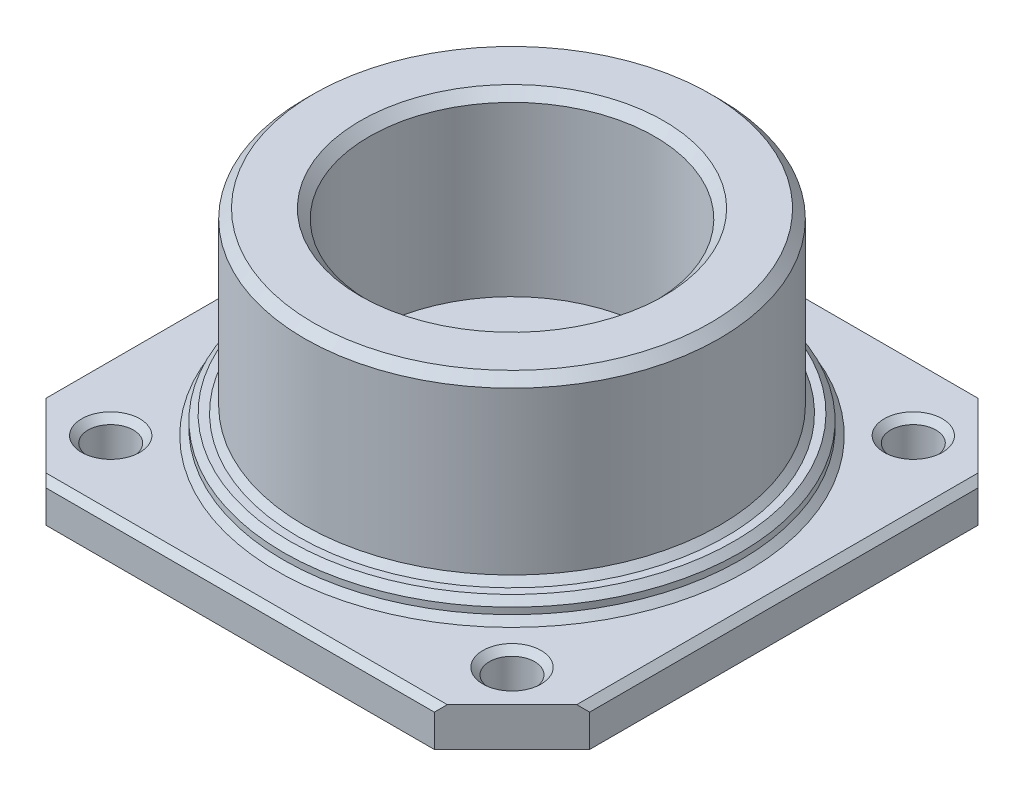
ISO-10303-21;
HEADER;
FILE_DESCRIPTION(('STEP AP214'),'2;1');
FILE_NAME('part.step','',(''),(''),'','','');
FILE_SCHEMA(('AUTOMOTIVE_DESIGN { 1 0 10303 214 1 1 1 1 }'));
ENDSEC;
DATA;
#1=APPLICATION_CONTEXT('core data for automotive mechanical design processes');
#2=APPLICATION_PROTOCOL_DEFINITION('international standard','automotive_design',2000,#1);
#3=PRODUCT_CONTEXT('',#1,'mechanical');
#4=PRODUCT('Part','Part','',(#3));
#5=PRODUCT_RELATED_PRODUCT_CATEGORY('part','',(#4));
#6=PRODUCT_DEFINITION_FORMATION('','',#4);
#7=PRODUCT_DEFINITION_CONTEXT('part definition',#1,'design');
#8=PRODUCT_DEFINITION('design','',#6,#7);
#9=PRODUCT_DEFINITION_SHAPE('','',#8);
#10=(LENGTH_UNIT() NAMED_UNIT(*) SI_UNIT(.MILLI.,.METRE.));
#11=(NAMED_UNIT(*) PLANE_ANGLE_UNIT() SI_UNIT($,.RADIAN.));
#12=(NAMED_UNIT(*) SI_UNIT($,.STERADIAN.) SOLID_ANGLE_UNIT());
#13=UNCERTAINTY_MEASURE_WITH_UNIT(LENGTH_MEASURE(1.E-05),#10,'distance_accuracy_value','');
#14=(GEOMETRIC_REPRESENTATION_CONTEXT(3) GLOBAL_UNCERTAINTY_ASSIGNED_CONTEXT((#13)) GLOBAL_UNIT_ASSIGNED_CONTEXT((#10,
#11,#12)) REPRESENTATION_CONTEXT('',''));
#15=CARTESIAN_POINT('',(0.,0.,0.));
#16=DIRECTION('',(0.,0.,1.));
#17=DIRECTION('',(1.,0.,0.));
#18=AXIS2_PLACEMENT_3D('',#15,#16,#17);
#19=CARTESIAN_POINT('',(0.,17.5,0.));
#20=DIRECTION('',(0.,-1.,0.));
#21=DIRECTION('',(0.,0.,-1.));
#22=AXIS2_PLACEMENT_3D('',#19,#20,#21);
#23=CONICAL_SURFACE('',#22,15.025,0.785398163397445);
#24=CARTESIAN_POINT('',(0.,16.5,0.));
#25=DIRECTION('',(0.,1.,0.));
#26=DIRECTION('',(0.,0.,1.));
#27=AXIS2_PLACEMENT_3D('',#24,#25,#26);
#28=CIRCLE('',#27,16.025);
#29=CARTESIAN_POINT('',(0.,16.5,16.025));
#30=VERTEX_POINT('',#29);
#31=EDGE_CURVE('E308',#30,#30,#28,.F.);
#32=ORIENTED_EDGE('',*,*,#31,.F.);
#33=EDGE_LOOP('',(#32));
#34=FACE_BOUND('',#33,.T.);
#35=CARTESIAN_POINT('',(0.,17.2,0.));
#36=DIRECTION('',(0.,1.,0.));
#37=DIRECTION('',(0.,0.,1.));
#38=AXIS2_PLACEMENT_3D('',#35,#36,#37);
#39=CIRCLE('',#38,15.325);
#40=CARTESIAN_POINT('',(0.,17.2,15.325));
#41=VERTEX_POINT('',#40);
#42=EDGE_CURVE('E194',#41,#41,#39,.F.);
#43=ORIENTED_EDGE('',*,*,#42,.T.);
#44=EDGE_LOOP('',(#43));
#45=FACE_BOUND('',#44,.T.);
#46=ADVANCED_FACE('F44',(#34,#45),#23,.T.);
#47=CARTESIAN_POINT('',(0.,16.5,0.));
#48=DIRECTION('',(0.,1.,0.));
#49=DIRECTION('',(0.,0.,1.));
#50=AXIS2_PLACEMENT_3D('',#47,#48,#49);
#51=CONICAL_SURFACE('',#50,11.025,0.785398163397451);
#52=CARTESIAN_POINT('',(0.,16.5,0.));
#53=DIRECTION('',(0.,1.,0.));
#54=DIRECTION('',(0.,0.,1.));
#55=AXIS2_PLACEMENT_3D('',#52,#53,#54);
#56=CIRCLE('',#55,11.025);
#57=CARTESIAN_POINT('',(0.,16.5,11.025));
#58=VERTEX_POINT('',#57);
#59=EDGE_CURVE('E148',#58,#58,#56,.T.);
#60=ORIENTED_EDGE('',*,*,#59,.F.);
#61=EDGE_LOOP('',(#60));
#62=FACE_BOUND('',#61,.T.);
#63=CARTESIAN_POINT('',(0.,17.2,0.));
#64=DIRECTION('',(0.,1.,0.));
#65=DIRECTION('',(0.,0.,1.));
#66=AXIS2_PLACEMENT_3D('',#63,#64,#65);
#67=CIRCLE('',#66,11.725);
#68=CARTESIAN_POINT('',(0.,17.2,11.725));
#69=VERTEX_POINT('',#68);
#70=EDGE_CURVE('E49',#69,#69,#67,.T.);
#71=ORIENTED_EDGE('',*,*,#70,.T.);
#72=EDGE_LOOP('',(#71));
#73=FACE_BOUND('',#72,.T.);
#74=ADVANCED_FACE('F416',(#62,#73),#51,.F.);
#75=CARTESIAN_POINT('',(0.,3.5,0.));
#76=DIRECTION('',(0.,1.,0.));
#77=DIRECTION('',(0.,0.,1.));
#78=AXIS2_PLACEMENT_3D('',#75,#76,#77);
#79=PLANE('',#78);
#80=CARTESIAN_POINT('',(0.,3.5,0.));
#81=DIRECTION('',(0.,1.,0.));
#82=DIRECTION('',(0.,0.,1.));
#83=AXIS2_PLACEMENT_3D('',#80,#81,#82);
#84=CIRCLE('',#83,4.45);
#85=CARTESIAN_POINT('',(0.,3.5,4.45));
#86=VERTEX_POINT('',#85);
#87=EDGE_CURVE('E258',#86,#86,#84,.F.);
#88=ORIENTED_EDGE('',*,*,#87,.T.);
#89=EDGE_LOOP('',(#88));
#90=FACE_BOUND('',#89,.T.);
#91=CARTESIAN_POINT('',(0.,3.5,0.));
#92=DIRECTION('',(0.,1.,0.));
#93=DIRECTION('',(0.,0.,1.));
#94=AXIS2_PLACEMENT_3D('',#91,#92,#93);
#95=CIRCLE('',#94,11.025);
#96=CARTESIAN_POINT('',(0.,3.5,11.025));
#97=VERTEX_POINT('',#96);
#98=EDGE_CURVE('E198',#97,#97,#95,.T.);
#99=ORIENTED_EDGE('',*,*,#98,.T.);
#100=EDGE_LOOP('',(#99));
#101=FACE_BOUND('',#100,.T.);
#102=ADVANCED_FACE('F422',(#90,#101),#79,.T.);
#103=CARTESIAN_POINT('',(0.,2.,0.));
#104=DIRECTION('',(0.,-1.,0.));
#105=DIRECTION('',(0.,0.,-1.));
#106=AXIS2_PLACEMENT_3D('',#103,#104,#105);
#107=PLANE('',#106);
#108=CARTESIAN_POINT('',(15.5,2.,15.5));
#109=DIRECTION('',(0.,-1.,0.));
#110=DIRECTION('',(0.,0.,-1.));
#111=AXIS2_PLACEMENT_3D('',#108,#109,#110);
#112=CIRCLE('',#111,2.24999999999999);
#113=CARTESIAN_POINT('',(15.5,2.,13.25));
#114=VERTEX_POINT('',#113);
#115=EDGE_CURVE('E242',#114,#114,#112,.T.);
#116=ORIENTED_EDGE('',*,*,#115,.T.);
#117=EDGE_LOOP('',(#116));
#118=FACE_BOUND('',#117,.T.);
#119=CARTESIAN_POINT('',(15.5,2.,-15.5));
#120=DIRECTION('',(0.,-1.,0.));
#121=DIRECTION('',(0.,0.,-1.));
#122=AXIS2_PLACEMENT_3D('',#119,#120,#121);
#123=CIRCLE('',#122,2.25);
#124=CARTESIAN_POINT('',(15.5,2.,-17.75));
#125=VERTEX_POINT('',#124);
#126=EDGE_CURVE('E238',#125,#125,#123,.T.);
#127=ORIENTED_EDGE('',*,*,#126,.T.);
#128=EDGE_LOOP('',(#127));
#129=FACE_BOUND('',#128,.T.);
#130=CARTESIAN_POINT('',(-15.5,2.,15.5));
#131=DIRECTION('',(0.,-1.,0.));
#132=DIRECTION('',(0.,0.,-1.));
#133=AXIS2_PLACEMENT_3D('',#130,#131,#132);
#134=CIRCLE('',#133,2.25);
#135=CARTESIAN_POINT('',(-15.5,2.,13.25));
#136=VERTEX_POINT('',#135);
#137=EDGE_CURVE('E234',#136,#136,#134,.T.);
#138=ORIENTED_EDGE('',*,*,#137,.T.);
#139=EDGE_LOOP('',(#138));
#140=FACE_BOUND('',#139,.T.);
#141=CARTESIAN_POINT('',(-15.5,2.,-15.5));
#142=DIRECTION('',(0.,-1.,0.));
#143=DIRECTION('',(0.,0.,-1.));
#144=AXIS2_PLACEMENT_3D('',#141,#142,#143);
#145=CIRCLE('',#144,2.25);
#146=CARTESIAN_POINT('',(-15.5,2.,-17.75));
#147=VERTEX_POINT('',#146);
#148=EDGE_CURVE('E230',#147,#147,#145,.T.);
#149=ORIENTED_EDGE('',*,*,#148,.T.);
#150=EDGE_LOOP('',(#149));
#151=FACE_BOUND('',#150,.T.);
#152=DIRECTION('',(-1.,0.,0.));
#153=VECTOR('',#152,1.);
#154=CARTESIAN_POINT('',(0.,2.,-20.5));
#155=LINE('',#154,#153);
#156=CARTESIAN_POINT('',(15.5,2.,-20.5));
#157=VERTEX_POINT('',#156);
#158=CARTESIAN_POINT('',(-15.5,2.,-20.5));
#159=VERTEX_POINT('',#158);
#160=EDGE_CURVE('E222',#157,#159,#155,.T.);
#161=ORIENTED_EDGE('',*,*,#160,.T.);
#162=DIRECTION('',(0.707106781186549,0.,-0.707106781186546));
#163=VECTOR('',#162,1.);
#164=CARTESIAN_POINT('',(-21.,2.,-15.));
#165=LINE('',#164,#163);
#166=CARTESIAN_POINT('',(-20.5,2.,-15.5));
#167=VERTEX_POINT('',#166);
#168=EDGE_CURVE('E338',#159,#167,#165,.F.);
#169=ORIENTED_EDGE('',*,*,#168,.T.);
#170=DIRECTION('',(0.,0.,1.));
#171=VECTOR('',#170,1.);
#172=CARTESIAN_POINT('',(-20.5,2.,0.));
#173=LINE('',#172,#171);
#174=CARTESIAN_POINT('',(-20.5,2.,15.5));
#175=VERTEX_POINT('',#174);
#176=EDGE_CURVE('E226',#167,#175,#173,.T.);
#177=ORIENTED_EDGE('',*,*,#176,.T.);
#178=DIRECTION('',(-0.707106781186546,0.,-0.707106781186549));
#179=VECTOR('',#178,1.);
#180=CARTESIAN_POINT('',(-15.,2.,21.));
#181=LINE('',#180,#179);
#182=CARTESIAN_POINT('',(-15.5,2.,20.5));
#183=VERTEX_POINT('',#182);
#184=EDGE_CURVE('E335',#175,#183,#181,.F.);
#185=ORIENTED_EDGE('',*,*,#184,.T.);
#186=DIRECTION('',(1.,0.,0.));
#187=VECTOR('',#186,1.);
#188=CARTESIAN_POINT('',(0.,2.,20.5));
#189=LINE('',#188,#187);
#190=CARTESIAN_POINT('',(15.5,2.,20.5));
#191=VERTEX_POINT('',#190);
#192=EDGE_CURVE('E214',#183,#191,#189,.T.);
#193=ORIENTED_EDGE('',*,*,#192,.T.);
#194=DIRECTION('',(-0.707106781186549,0.,0.707106781186546));
#195=VECTOR('',#194,1.);
#196=CARTESIAN_POINT('',(21.,2.,15.));
#197=LINE('',#196,#195);
#198=CARTESIAN_POINT('',(20.5,2.,15.5));
#199=VERTEX_POINT('',#198);
#200=EDGE_CURVE('E332',#191,#199,#197,.F.);
#201=ORIENTED_EDGE('',*,*,#200,.T.);
#202=DIRECTION('',(0.,0.,-1.));
#203=VECTOR('',#202,1.);
#204=CARTESIAN_POINT('',(20.5,2.,0.));
#205=LINE('',#204,#203);
#206=CARTESIAN_POINT('',(20.5,2.,-15.5));
#207=VERTEX_POINT('',#206);
#208=EDGE_CURVE('E218',#199,#207,#205,.T.);
#209=ORIENTED_EDGE('',*,*,#208,.T.);
#210=DIRECTION('',(0.707106781186546,0.,0.707106781186549));
#211=VECTOR('',#210,1.);
#212=CARTESIAN_POINT('',(15.,2.,-21.));
#213=LINE('',#212,#211);
#214=EDGE_CURVE('E329',#207,#157,#213,.F.);
#215=ORIENTED_EDGE('',*,*,#214,.T.);
#216=EDGE_LOOP('',(#161,#169,#177,#185,#193,#201,#209,#215));
#217=FACE_BOUND('',#216,.T.);
#218=CARTESIAN_POINT('',(0.,2.,0.));
#219=DIRECTION('',(0.,-1.,0.));
#220=DIRECTION('',(0.,0.,-1.));
#221=AXIS2_PLACEMENT_3D('',#218,#219,#220);
#222=CIRCLE('',#221,18.15);
#223=CARTESIAN_POINT('',(0.,2.,-18.15));
#224=VERTEX_POINT('',#223);
#225=EDGE_CURVE('E210',#224,#224,#222,.T.);
#226=ORIENTED_EDGE('',*,*,#225,.T.);
#227=EDGE_LOOP('',(#226));
#228=FACE_BOUND('',#227,.T.);
#229=ADVANCED_FACE('F369',(#118,#129,#140,#151,#217,#228),#107,.F.);
#230=CARTESIAN_POINT('',(21.,2.,21.));
#231=DIRECTION('',(-1.,0.,0.));
#232=DIRECTION('',(0.,0.,1.));
#233=AXIS2_PLACEMENT_3D('',#230,#231,#232);
#234=PLANE('',#233);
#235=DIRECTION('',(0.,0.,1.));
#236=VECTOR('',#235,1.);
#237=CARTESIAN_POINT('',(21.,1.50000000000001,21.));
#238=LINE('',#237,#236);
#239=CARTESIAN_POINT('',(21.,1.50000000000001,-15.));
#240=VERTEX_POINT('',#239);
#241=CARTESIAN_POINT('',(21.,1.50000000000001,15.));
#242=VERTEX_POINT('',#241);
#243=EDGE_CURVE('E301',#240,#242,#238,.T.);
#244=ORIENTED_EDGE('',*,*,#243,.T.);
#245=DIRECTION('',(0.,-1.,0.));
#246=VECTOR('',#245,1.);
#247=CARTESIAN_POINT('',(21.,2.,15.));
#248=LINE('',#247,#246);
#249=CARTESIAN_POINT('',(21.,-1.,15.));
#250=VERTEX_POINT('',#249);
#251=EDGE_CURVE('E360',#242,#250,#248,.T.);
#252=ORIENTED_EDGE('',*,*,#251,.T.);
#253=DIRECTION('',(0.,0.,1.));
#254=VECTOR('',#253,1.);
#255=CARTESIAN_POINT('',(21.,-1.,-15.));
#256=LINE('',#255,#254);
#257=CARTESIAN_POINT('',(21.,-1.,-15.));
#258=VERTEX_POINT('',#257);
#259=EDGE_CURVE('E185',#258,#250,#256,.T.);
#260=ORIENTED_EDGE('',*,*,#259,.F.);
#261=DIRECTION('',(0.,1.,0.));
#262=VECTOR('',#261,1.);
#263=CARTESIAN_POINT('',(21.,2.,-15.));
#264=LINE('',#263,#262);
#265=EDGE_CURVE('E67',#258,#240,#264,.T.);
#266=ORIENTED_EDGE('',*,*,#265,.T.);
#267=EDGE_LOOP('',(#244,#252,#260,#266));
#268=FACE_BOUND('',#267,.T.);
#269=ADVANCED_FACE('F387',(#268),#234,.F.);
#270=CARTESIAN_POINT('',(-21.,2.,-21.));
#271=DIRECTION('',(0.,0.,1.));
#272=DIRECTION('',(1.,0.,0.));
#273=AXIS2_PLACEMENT_3D('',#270,#271,#272);
#274=PLANE('',#273);
#275=DIRECTION('',(0.,-1.,0.));
#276=VECTOR('',#275,1.);
#277=CARTESIAN_POINT('',(15.,2.,-21.));
#278=LINE('',#277,#276);
#279=CARTESIAN_POINT('',(15.,1.50000000000001,-21.));
#280=VERTEX_POINT('',#279);
#281=CARTESIAN_POINT('',(15.,-1.,-21.));
#282=VERTEX_POINT('',#281);
#283=EDGE_CURVE('E317',#280,#282,#278,.T.);
#284=ORIENTED_EDGE('',*,*,#283,.T.);
#285=DIRECTION('',(1.,0.,0.));
#286=VECTOR('',#285,1.);
#287=CARTESIAN_POINT('',(-15.,-1.,-21.));
#288=LINE('',#287,#286);
#289=CARTESIAN_POINT('',(-15.,-1.,-21.));
#290=VERTEX_POINT('',#289);
#291=EDGE_CURVE('E177',#290,#282,#288,.T.);
#292=ORIENTED_EDGE('',*,*,#291,.F.);
#293=DIRECTION('',(0.,1.,0.));
#294=VECTOR('',#293,1.);
#295=CARTESIAN_POINT('',(-15.,2.,-21.));
#296=LINE('',#295,#294);
#297=CARTESIAN_POINT('',(-15.,1.50000000000001,-21.));
#298=VERTEX_POINT('',#297);
#299=EDGE_CURVE('E320',#290,#298,#296,.T.);
#300=ORIENTED_EDGE('',*,*,#299,.T.);
#301=DIRECTION('',(1.,0.,0.));
#302=VECTOR('',#301,1.);
#303=CARTESIAN_POINT('',(-21.,1.50000000000001,-21.));
#304=LINE('',#303,#302);
#305=EDGE_CURVE('E297',#298,#280,#304,.T.);
#306=ORIENTED_EDGE('',*,*,#305,.T.);
#307=EDGE_LOOP('',(#284,#292,#300,#306));
#308=FACE_BOUND('',#307,.T.);
#309=ADVANCED_FACE('F381',(#308),#274,.F.);
#310=CARTESIAN_POINT('',(-21.,2.,21.));
#311=DIRECTION('',(1.,0.,0.));
#312=DIRECTION('',(0.,0.,-1.));
#313=AXIS2_PLACEMENT_3D('',#310,#311,#312);
#314=PLANE('',#313);
#315=DIRECTION('',(0.,0.,-1.));
#316=VECTOR('',#315,1.);
#317=CARTESIAN_POINT('',(-21.,1.50000000000001,21.));
#318=LINE('',#317,#316);
#319=CARTESIAN_POINT('',(-21.,1.50000000000001,15.));
#320=VERTEX_POINT('',#319);
#321=CARTESIAN_POINT('',(-21.,1.50000000000001,-15.));
#322=VERTEX_POINT('',#321);
#323=EDGE_CURVE('E294',#320,#322,#318,.T.);
#324=ORIENTED_EDGE('',*,*,#323,.T.);
#325=DIRECTION('',(0.,-1.,0.));
#326=VECTOR('',#325,1.);
#327=CARTESIAN_POINT('',(-21.,2.,-15.));
#328=LINE('',#327,#326);
#329=CARTESIAN_POINT('',(-21.,-1.,-15.));
#330=VERTEX_POINT('',#329);
#331=EDGE_CURVE('E147',#322,#330,#328,.T.);
#332=ORIENTED_EDGE('',*,*,#331,.T.);
#333=DIRECTION('',(0.,0.,-1.));
#334=VECTOR('',#333,1.);
#335=CARTESIAN_POINT('',(-21.,-1.,15.));
#336=LINE('',#335,#334);
#337=CARTESIAN_POINT('',(-21.,-1.,15.));
#338=VERTEX_POINT('',#337);
#339=EDGE_CURVE('E151',#338,#330,#336,.T.);
#340=ORIENTED_EDGE('',*,*,#339,.F.);
#341=DIRECTION('',(0.,1.,0.));
#342=VECTOR('',#341,1.);
#343=CARTESIAN_POINT('',(-21.,2.,15.));
#344=LINE('',#343,#342);
#345=EDGE_CURVE('E135',#338,#320,#344,.T.);
#346=ORIENTED_EDGE('',*,*,#345,.T.);
#347=EDGE_LOOP('',(#324,#332,#340,#346));
#348=FACE_BOUND('',#347,.T.);
#349=ADVANCED_FACE('F152',(#348),#314,.F.);
#350=CARTESIAN_POINT('',(-21.,2.,21.));
#351=DIRECTION('',(0.,0.,-1.));
#352=DIRECTION('',(-1.,0.,0.));
#353=AXIS2_PLACEMENT_3D('',#350,#351,#352);
#354=PLANE('',#353);
#355=DIRECTION('',(-1.,0.,0.));
#356=VECTOR('',#355,1.);
#357=CARTESIAN_POINT('',(-21.,1.50000000000001,21.));
#358=LINE('',#357,#356);
#359=CARTESIAN_POINT('',(15.,1.50000000000001,21.));
#360=VERTEX_POINT('',#359);
#361=CARTESIAN_POINT('',(-15.,1.50000000000001,21.));
#362=VERTEX_POINT('',#361);
#363=EDGE_CURVE('E304',#360,#362,#358,.T.);
#364=ORIENTED_EDGE('',*,*,#363,.T.);
#365=DIRECTION('',(0.,-1.,0.));
#366=VECTOR('',#365,1.);
#367=CARTESIAN_POINT('',(-15.,2.,21.));
#368=LINE('',#367,#366);
#369=CARTESIAN_POINT('',(-15.,-1.,21.));
#370=VERTEX_POINT('',#369);
#371=EDGE_CURVE('E349',#362,#370,#368,.T.);
#372=ORIENTED_EDGE('',*,*,#371,.T.);
#373=DIRECTION('',(-1.,0.,0.));
#374=VECTOR('',#373,1.);
#375=CARTESIAN_POINT('',(15.,-1.,21.));
#376=LINE('',#375,#374);
#377=CARTESIAN_POINT('',(15.,-1.,21.));
#378=VERTEX_POINT('',#377);
#379=EDGE_CURVE('E165',#378,#370,#376,.T.);
#380=ORIENTED_EDGE('',*,*,#379,.F.);
#381=DIRECTION('',(0.,1.,0.));
#382=VECTOR('',#381,1.);
#383=CARTESIAN_POINT('',(15.,2.,21.));
#384=LINE('',#383,#382);
#385=EDGE_CURVE('E346',#378,#360,#384,.T.);
#386=ORIENTED_EDGE('',*,*,#385,.T.);
#387=EDGE_LOOP('',(#364,#372,#380,#386));
#388=FACE_BOUND('',#387,.T.);
#389=ADVANCED_FACE('F393',(#388),#354,.F.);
#390=CARTESIAN_POINT('',(0.,2.,0.));
#391=DIRECTION('',(0.,-1.,0.));
#392=DIRECTION('',(0.,0.,-1.));
#393=AXIS2_PLACEMENT_3D('',#390,#391,#392);
#394=CYLINDRICAL_SURFACE('',#393,12.65);
#395=CARTESIAN_POINT('',(0.,2.1,0.));
#396=DIRECTION('',(0.,1.,0.));
#397=DIRECTION('',(0.,0.,1.));
#398=AXIS2_PLACEMENT_3D('',#395,#396,#397);
#399=CIRCLE('',#398,12.65);
#400=CARTESIAN_POINT('',(0.,2.1,12.65));
#401=VERTEX_POINT('',#400);
#402=EDGE_CURVE('E202',#401,#401,#399,.T.);
#403=ORIENTED_EDGE('',*,*,#402,.T.);
#404=EDGE_LOOP('',(#403));
#405=FACE_BOUND('',#404,.T.);
#406=CARTESIAN_POINT('',(0.,-1.,0.));
#407=DIRECTION('',(0.,-1.,0.));
#408=DIRECTION('',(0.,0.,-1.));
#409=AXIS2_PLACEMENT_3D('',#406,#407,#408);
#410=CIRCLE('',#409,12.65);
#411=CARTESIAN_POINT('',(0.,-1.,-12.65));
#412=VERTEX_POINT('',#411);
#413=EDGE_CURVE('E592',#412,#412,#410,.T.);
#414=ORIENTED_EDGE('',*,*,#413,.T.);
#415=EDGE_LOOP('',(#414));
#416=FACE_BOUND('',#415,.T.);
#417=ADVANCED_FACE('F506',(#405,#416),#394,.F.);
#418=CARTESIAN_POINT('',(-15.5,2.,-15.5));
#419=DIRECTION('',(0.,-1.,0.));
#420=DIRECTION('',(0.,0.,-1.));
#421=AXIS2_PLACEMENT_3D('',#418,#419,#420);
#422=CYLINDRICAL_SURFACE('',#421,1.75);
#423=CARTESIAN_POINT('',(-15.5,1.50000000000001,-15.5));
#424=DIRECTION('',(0.,-1.,0.));
#425=DIRECTION('',(0.,0.,-1.));
#426=AXIS2_PLACEMENT_3D('',#423,#424,#425);
#427=CIRCLE('',#426,1.75);
#428=CARTESIAN_POINT('',(-15.5,1.50000000000001,-17.25));
#429=VERTEX_POINT('',#428);
#430=EDGE_CURVE('E290',#429,#429,#427,.F.);
#431=ORIENTED_EDGE('',*,*,#430,.T.);
#432=EDGE_LOOP('',(#431));
#433=FACE_BOUND('',#432,.T.);
#434=CARTESIAN_POINT('',(-15.5,-1.,-15.5));
#435=DIRECTION('',(0.,-1.,0.));
#436=DIRECTION('',(0.,0.,-1.));
#437=AXIS2_PLACEMENT_3D('',#434,#435,#436);
#438=CIRCLE('',#437,1.75);
#439=CARTESIAN_POINT('',(-15.5,-1.,-17.25));
#440=VERTEX_POINT('',#439);
#441=EDGE_CURVE('E585',#440,#440,#438,.T.);
#442=ORIENTED_EDGE('',*,*,#441,.T.);
#443=EDGE_LOOP('',(#442));
#444=FACE_BOUND('',#443,.T.);
#445=ADVANCED_FACE('F502',(#433,#444),#422,.F.);
#446=CARTESIAN_POINT('',(15.5,2.,-15.5));
#447=DIRECTION('',(0.,-1.,0.));
#448=DIRECTION('',(0.,0.,-1.));
#449=AXIS2_PLACEMENT_3D('',#446,#447,#448);
#450=CYLINDRICAL_SURFACE('',#449,1.75);
#451=CARTESIAN_POINT('',(15.5,1.5,-15.5));
#452=DIRECTION('',(0.,-1.,0.));
#453=DIRECTION('',(0.,0.,-1.));
#454=AXIS2_PLACEMENT_3D('',#451,#452,#453);
#455=CIRCLE('',#454,1.75);
#456=CARTESIAN_POINT('',(15.5,1.5,-17.25));
#457=VERTEX_POINT('',#456);
#458=EDGE_CURVE('E282',#457,#457,#455,.F.);
#459=ORIENTED_EDGE('',*,*,#458,.T.);
#460=EDGE_LOOP('',(#459));
#461=FACE_BOUND('',#460,.T.);
#462=CARTESIAN_POINT('',(15.5,-1.,-15.5));
#463=DIRECTION('',(0.,-1.,0.));
#464=DIRECTION('',(0.,0.,-1.));
#465=AXIS2_PLACEMENT_3D('',#462,#463,#464);
#466=CIRCLE('',#465,1.75);
#467=CARTESIAN_POINT('',(15.5,-1.,-17.25));
#468=VERTEX_POINT('',#467);
#469=EDGE_CURVE('E588',#468,#468,#466,.T.);
#470=ORIENTED_EDGE('',*,*,#469,.T.);
#471=EDGE_LOOP('',(#470));
#472=FACE_BOUND('',#471,.T.);
#473=ADVANCED_FACE('F498',(#461,#472),#450,.F.);
#474=CARTESIAN_POINT('',(15.5,2.,15.5));
#475=DIRECTION('',(0.,-1.,0.));
#476=DIRECTION('',(0.,0.,-1.));
#477=AXIS2_PLACEMENT_3D('',#474,#475,#476);
#478=CYLINDRICAL_SURFACE('',#477,1.75);
#479=CARTESIAN_POINT('',(15.5,1.5,15.5));
#480=DIRECTION('',(0.,-1.,0.));
#481=DIRECTION('',(0.,0.,-1.));
#482=AXIS2_PLACEMENT_3D('',#479,#480,#481);
#483=CIRCLE('',#482,1.75);
#484=CARTESIAN_POINT('',(15.5,1.5,13.75));
#485=VERTEX_POINT('',#484);
#486=EDGE_CURVE('E206',#485,#485,#483,.F.);
#487=ORIENTED_EDGE('',*,*,#486,.T.);
#488=EDGE_LOOP('',(#487));
#489=FACE_BOUND('',#488,.T.);
#490=CARTESIAN_POINT('',(15.5,-1.,15.5));
#491=DIRECTION('',(0.,-1.,0.));
#492=DIRECTION('',(0.,0.,-1.));
#493=AXIS2_PLACEMENT_3D('',#490,#491,#492);
#494=CIRCLE('',#493,1.75);
#495=CARTESIAN_POINT('',(15.5,-1.,13.75));
#496=VERTEX_POINT('',#495);
#497=EDGE_CURVE('E167',#496,#496,#494,.T.);
#498=ORIENTED_EDGE('',*,*,#497,.T.);
#499=EDGE_LOOP('',(#498));
#500=FACE_BOUND('',#499,.T.);
#501=ADVANCED_FACE('F494',(#489,#500),#478,.F.);
#502=CARTESIAN_POINT('',(-15.5,2.,15.5));
#503=DIRECTION('',(0.,-1.,0.));
#504=DIRECTION('',(0.,0.,-1.));
#505=AXIS2_PLACEMENT_3D('',#502,#503,#504);
#506=CYLINDRICAL_SURFACE('',#505,1.75);
#507=CARTESIAN_POINT('',(-15.5,1.50000000000001,15.5));
#508=DIRECTION('',(0.,-1.,0.));
#509=DIRECTION('',(0.,0.,-1.));
#510=AXIS2_PLACEMENT_3D('',#507,#508,#509);
#511=CIRCLE('',#510,1.75);
#512=CARTESIAN_POINT('',(-15.5,1.50000000000001,13.75));
#513=VERTEX_POINT('',#512);
#514=EDGE_CURVE('E286',#513,#513,#511,.F.);
#515=ORIENTED_EDGE('',*,*,#514,.T.);
#516=EDGE_LOOP('',(#515));
#517=FACE_BOUND('',#516,.T.);
#518=CARTESIAN_POINT('',(-15.5,-1.,15.5));
#519=DIRECTION('',(0.,-1.,0.));
#520=DIRECTION('',(0.,0.,-1.));
#521=AXIS2_PLACEMENT_3D('',#518,#519,#520);
#522=CIRCLE('',#521,1.75);
#523=CARTESIAN_POINT('',(-15.5,-1.,13.75));
#524=VERTEX_POINT('',#523);
#525=EDGE_CURVE('E171',#524,#524,#522,.T.);
#526=ORIENTED_EDGE('',*,*,#525,.T.);
#527=EDGE_LOOP('',(#526));
#528=FACE_BOUND('',#527,.T.);
#529=ADVANCED_FACE('F490',(#517,#528),#506,.F.);
#530=CARTESIAN_POINT('',(0.,2.1,0.));
#531=DIRECTION('',(0.,-1.,0.));
#532=DIRECTION('',(0.,0.,-1.));
#533=AXIS2_PLACEMENT_3D('',#530,#531,#532);
#534=CYLINDRICAL_SURFACE('',#533,17.65);
#535=CARTESIAN_POINT('',(0.,3.00000000000002,0.));
#536=DIRECTION('',(0.,1.,0.));
#537=DIRECTION('',(0.,0.,1.));
#538=AXIS2_PLACEMENT_3D('',#535,#536,#537);
#539=CIRCLE('',#538,17.65);
#540=CARTESIAN_POINT('',(0.,3.00000000000002,17.65));
#541=VERTEX_POINT('',#540);
#542=EDGE_CURVE('E274',#541,#541,#539,.F.);
#543=ORIENTED_EDGE('',*,*,#542,.T.);
#544=EDGE_LOOP('',(#543));
#545=FACE_BOUND('',#544,.T.);
#546=CARTESIAN_POINT('',(0.,2.5,0.));
#547=DIRECTION('',(0.,-1.,0.));
#548=DIRECTION('',(0.,0.,-1.));
#549=AXIS2_PLACEMENT_3D('',#546,#547,#548);
#550=CIRCLE('',#549,17.65);
#551=CARTESIAN_POINT('',(0.,2.5,-17.65));
#552=VERTEX_POINT('',#551);
#553=EDGE_CURVE('E270',#552,#552,#550,.F.);
#554=ORIENTED_EDGE('',*,*,#553,.T.);
#555=EDGE_LOOP('',(#554));
#556=FACE_BOUND('',#555,.T.);
#557=ADVANCED_FACE('F483',(#545,#556),#534,.T.);
#558=CARTESIAN_POINT('',(0.,2.1,0.));
#559=DIRECTION('',(0.,1.,0.));
#560=DIRECTION('',(0.,0.,1.));
#561=AXIS2_PLACEMENT_3D('',#558,#559,#560);
#562=PLANE('',#561);
#563=CARTESIAN_POINT('',(0.,2.1,0.));
#564=DIRECTION('',(0.,1.,0.));
#565=DIRECTION('',(0.,0.,1.));
#566=AXIS2_PLACEMENT_3D('',#563,#564,#565);
#567=CIRCLE('',#566,4.44999999999999);
#568=CARTESIAN_POINT('',(0.,2.1,4.44999999999999));
#569=VERTEX_POINT('',#568);
#570=EDGE_CURVE('E246',#569,#569,#567,.T.);
#571=ORIENTED_EDGE('',*,*,#570,.T.);
#572=EDGE_LOOP('',(#571));
#573=FACE_BOUND('',#572,.T.);
#574=ORIENTED_EDGE('',*,*,#402,.F.);
#575=EDGE_LOOP('',(#574));
#576=FACE_BOUND('',#575,.T.);
#577=ADVANCED_FACE('F480',(#573,#576),#562,.F.);
#578=CARTESIAN_POINT('',(0.,3.5,0.));
#579=DIRECTION('',(0.,-1.,0.));
#580=DIRECTION('',(0.,0.,-1.));
#581=AXIS2_PLACEMENT_3D('',#578,#579,#580);
#582=CYLINDRICAL_SURFACE('',#581,3.95);
#583=CARTESIAN_POINT('',(0.,2.59999999999999,0.));
#584=DIRECTION('',(0.,1.,0.));
#585=DIRECTION('',(0.,0.,1.));
#586=AXIS2_PLACEMENT_3D('',#583,#584,#585);
#587=CIRCLE('',#586,3.95);
#588=CARTESIAN_POINT('',(0.,2.59999999999999,3.95));
#589=VERTEX_POINT('',#588);
#590=EDGE_CURVE('E254',#589,#589,#587,.F.);
#591=ORIENTED_EDGE('',*,*,#590,.T.);
#592=EDGE_LOOP('',(#591));
#593=FACE_BOUND('',#592,.T.);
#594=CARTESIAN_POINT('',(0.,3.,0.));
#595=DIRECTION('',(0.,1.,0.));
#596=DIRECTION('',(0.,0.,1.));
#597=AXIS2_PLACEMENT_3D('',#594,#595,#596);
#598=CIRCLE('',#597,3.95);
#599=CARTESIAN_POINT('',(0.,3.,3.95));
#600=VERTEX_POINT('',#599);
#601=EDGE_CURVE('E250',#600,#600,#598,.T.);
#602=ORIENTED_EDGE('',*,*,#601,.T.);
#603=EDGE_LOOP('',(#602));
#604=FACE_BOUND('',#603,.T.);
#605=ADVANCED_FACE('F478',(#593,#604),#582,.F.);
#606=CARTESIAN_POINT('',(0.,3.5,0.));
#607=DIRECTION('',(0.,1.,0.));
#608=DIRECTION('',(0.,0.,1.));
#609=AXIS2_PLACEMENT_3D('',#606,#607,#608);
#610=CIRCLE('',#609,17.15);
#611=CARTESIAN_POINT('',(0.,3.5,17.15));
#612=VERTEX_POINT('',#611);
#613=EDGE_CURVE('E266',#612,#612,#610,.T.);
#614=ORIENTED_EDGE('',*,*,#613,.T.);
#615=EDGE_LOOP('',(#614));
#616=FACE_BOUND('',#615,.T.);
#617=CARTESIAN_POINT('',(0.,3.5,0.));
#618=DIRECTION('',(0.,1.,0.));
#619=DIRECTION('',(0.,0.,1.));
#620=AXIS2_PLACEMENT_3D('',#617,#618,#619);
#621=CIRCLE('',#620,16.525);
#622=CARTESIAN_POINT('',(0.,3.5,16.525));
#623=VERTEX_POINT('',#622);
#624=EDGE_CURVE('E262',#623,#623,#621,.F.);
#625=ORIENTED_EDGE('',*,*,#624,.T.);
#626=EDGE_LOOP('',(#625));
#627=FACE_BOUND('',#626,.T.);
#628=ADVANCED_FACE('F474',(#616,#627),#79,.T.);
#629=CARTESIAN_POINT('',(0.,17.5,0.));
#630=DIRECTION('',(0.,-1.,0.));
#631=DIRECTION('',(0.,0.,-1.));
#632=AXIS2_PLACEMENT_3D('',#629,#630,#631);
#633=CYLINDRICAL_SURFACE('',#632,11.025);
#634=ORIENTED_EDGE('',*,*,#59,.T.);
#635=EDGE_LOOP('',(#634));
#636=FACE_BOUND('',#635,.T.);
#637=ORIENTED_EDGE('',*,*,#98,.F.);
#638=EDGE_LOOP('',(#637));
#639=FACE_BOUND('',#638,.T.);
#640=ADVANCED_FACE('F470',(#636,#639),#633,.F.);
#641=CARTESIAN_POINT('',(0.,17.5,0.));
#642=DIRECTION('',(0.,-1.,0.));
#643=DIRECTION('',(0.,0.,-1.));
#644=AXIS2_PLACEMENT_3D('',#641,#642,#643);
#645=CYLINDRICAL_SURFACE('',#644,16.025);
#646=ORIENTED_EDGE('',*,*,#31,.T.);
#647=EDGE_LOOP('',(#646));
#648=FACE_BOUND('',#647,.T.);
#649=CARTESIAN_POINT('',(0.,4.,0.));
#650=DIRECTION('',(0.,1.,0.));
#651=DIRECTION('',(0.,0.,1.));
#652=AXIS2_PLACEMENT_3D('',#649,#650,#651);
#653=CIRCLE('',#652,16.025);
#654=CARTESIAN_POINT('',(0.,4.,16.025));
#655=VERTEX_POINT('',#654);
#656=EDGE_CURVE('E278',#655,#655,#653,.T.);
#657=ORIENTED_EDGE('',*,*,#656,.T.);
#658=EDGE_LOOP('',(#657));
#659=FACE_BOUND('',#658,.T.);
#660=ADVANCED_FACE('F466',(#648,#659),#645,.T.);
#661=CARTESIAN_POINT('',(15.5,1.5,15.5));
#662=DIRECTION('',(0.,1.,0.));
#663=DIRECTION('',(0.,0.,1.));
#664=AXIS2_PLACEMENT_3D('',#661,#662,#663);
#665=CONICAL_SURFACE('',#664,1.75,0.785398163397449);
#666=ORIENTED_EDGE('',*,*,#115,.F.);
#667=EDGE_LOOP('',(#666));
#668=FACE_BOUND('',#667,.T.);
#669=ORIENTED_EDGE('',*,*,#486,.F.);
#670=EDGE_LOOP('',(#669));
#671=FACE_BOUND('',#670,.T.);
#672=ADVANCED_FACE('F469',(#668,#671),#665,.F.);
#673=CARTESIAN_POINT('',(0.,2.1,0.));
#674=DIRECTION('',(0.,-1.,0.));
#675=DIRECTION('',(0.,0.,-1.));
#676=AXIS2_PLACEMENT_3D('',#673,#674,#675);
#677=CONICAL_SURFACE('',#676,4.44999999999999,0.785398163397448);
#678=ORIENTED_EDGE('',*,*,#590,.F.);
#679=EDGE_LOOP('',(#678));
#680=FACE_BOUND('',#679,.T.);
#681=ORIENTED_EDGE('',*,*,#570,.F.);
#682=EDGE_LOOP('',(#681));
#683=FACE_BOUND('',#682,.T.);
#684=ADVANCED_FACE('F528',(#680,#683),#677,.F.);
#685=CARTESIAN_POINT('',(0.,3.,0.));
#686=DIRECTION('',(0.,1.,0.));
#687=DIRECTION('',(0.,0.,1.));
#688=AXIS2_PLACEMENT_3D('',#685,#686,#687);
#689=CONICAL_SURFACE('',#688,3.95,0.785398163397448);
#690=ORIENTED_EDGE('',*,*,#87,.F.);
#691=EDGE_LOOP('',(#690));
#692=FACE_BOUND('',#691,.T.);
#693=ORIENTED_EDGE('',*,*,#601,.F.);
#694=EDGE_LOOP('',(#693));
#695=FACE_BOUND('',#694,.T.);
#696=ADVANCED_FACE('F535',(#692,#695),#689,.F.);
#697=CARTESIAN_POINT('',(0.,3.5,0.));
#698=DIRECTION('',(0.,-1.,0.));
#699=DIRECTION('',(0.,0.,-1.));
#700=AXIS2_PLACEMENT_3D('',#697,#698,#699);
#701=CONICAL_SURFACE('',#700,17.15,0.785398163397445);
#702=ORIENTED_EDGE('',*,*,#542,.F.);
#703=EDGE_LOOP('',(#702));
#704=FACE_BOUND('',#703,.T.);
#705=ORIENTED_EDGE('',*,*,#613,.F.);
#706=EDGE_LOOP('',(#705));
#707=FACE_BOUND('',#706,.T.);
#708=ADVANCED_FACE('F542',(#704,#707),#701,.T.);
#709=CARTESIAN_POINT('',(0.,4.,0.));
#710=DIRECTION('',(0.,-1.,0.));
#711=DIRECTION('',(0.,0.,-1.));
#712=AXIS2_PLACEMENT_3D('',#709,#710,#711);
#713=CONICAL_SURFACE('',#712,16.025,0.785398163397441);
#714=ORIENTED_EDGE('',*,*,#624,.F.);
#715=EDGE_LOOP('',(#714));
#716=FACE_BOUND('',#715,.T.);
#717=ORIENTED_EDGE('',*,*,#656,.F.);
#718=EDGE_LOOP('',(#717));
#719=FACE_BOUND('',#718,.T.);
#720=ADVANCED_FACE('F549',(#716,#719),#713,.T.);
#721=CARTESIAN_POINT('',(15.5,1.5,-15.5));
#722=DIRECTION('',(0.,1.,0.));
#723=DIRECTION('',(0.,0.,1.));
#724=AXIS2_PLACEMENT_3D('',#721,#722,#723);
#725=CONICAL_SURFACE('',#724,1.75,0.785398163397449);
#726=ORIENTED_EDGE('',*,*,#126,.F.);
#727=EDGE_LOOP('',(#726));
#728=FACE_BOUND('',#727,.T.);
#729=ORIENTED_EDGE('',*,*,#458,.F.);
#730=EDGE_LOOP('',(#729));
#731=FACE_BOUND('',#730,.T.);
#732=ADVANCED_FACE('F556',(#728,#731),#725,.F.);
#733=CARTESIAN_POINT('',(-15.5,1.50000000000001,15.5));
#734=DIRECTION('',(0.,1.,0.));
#735=DIRECTION('',(0.,0.,1.));
#736=AXIS2_PLACEMENT_3D('',#733,#734,#735);
#737=CONICAL_SURFACE('',#736,1.75,0.785398163397449);
#738=ORIENTED_EDGE('',*,*,#137,.F.);
#739=EDGE_LOOP('',(#738));
#740=FACE_BOUND('',#739,.T.);
#741=ORIENTED_EDGE('',*,*,#514,.F.);
#742=EDGE_LOOP('',(#741));
#743=FACE_BOUND('',#742,.T.);
#744=ADVANCED_FACE('F563',(#740,#743),#737,.F.);
#745=CARTESIAN_POINT('',(-15.5,1.50000000000001,-15.5));
#746=DIRECTION('',(0.,1.,0.));
#747=DIRECTION('',(0.,0.,1.));
#748=AXIS2_PLACEMENT_3D('',#745,#746,#747);
#749=CONICAL_SURFACE('',#748,1.75,0.78539816339745);
#750=ORIENTED_EDGE('',*,*,#148,.F.);
#751=EDGE_LOOP('',(#750));
#752=FACE_BOUND('',#751,.T.);
#753=ORIENTED_EDGE('',*,*,#430,.F.);
#754=EDGE_LOOP('',(#753));
#755=FACE_BOUND('',#754,.T.);
#756=ADVANCED_FACE('F569',(#752,#755),#749,.F.);
#757=CARTESIAN_POINT('',(20.5,2.,0.));
#758=DIRECTION('',(-0.707106781186552,-0.707106781186543,0.));
#759=DIRECTION('',(0.,0.,-1.));
#760=AXIS2_PLACEMENT_3D('',#757,#758,#759);
#761=PLANE('',#760);
#762=ORIENTED_EDGE('',*,*,#208,.F.);
#763=DIRECTION('',(0.577350269189624,-0.577350269189632,-0.577350269189622));
#764=VECTOR('',#763,1.);
#765=CARTESIAN_POINT('',(25.6666666666666,-3.16666666666669,10.3333333333334));
#766=LINE('',#765,#764);
#767=EDGE_CURVE('E11',#199,#242,#766,.T.);
#768=ORIENTED_EDGE('',*,*,#767,.T.);
#769=ORIENTED_EDGE('',*,*,#243,.F.);
#770=DIRECTION('',(-0.577350269189623,0.577350269189631,-0.577350269189625));
#771=VECTOR('',#770,1.);
#772=CARTESIAN_POINT('',(25.6666666666666,-3.16666666666668,-10.3333333333333));
#773=LINE('',#772,#771);
#774=EDGE_CURVE('E55',#240,#207,#773,.T.);
#775=ORIENTED_EDGE('',*,*,#774,.T.);
#776=EDGE_LOOP('',(#762,#768,#769,#775));
#777=FACE_BOUND('',#776,.T.);
#778=ADVANCED_FACE('F365',(#777),#761,.F.);
#779=CARTESIAN_POINT('',(0.,2.,-20.5));
#780=DIRECTION('',(0.,-0.707106781186543,0.707106781186552));
#781=DIRECTION('',(-1.,0.,0.));
#782=AXIS2_PLACEMENT_3D('',#779,#780,#781);
#783=PLANE('',#782);
#784=ORIENTED_EDGE('',*,*,#305,.F.);
#785=DIRECTION('',(-0.577350269189625,0.57735026918963,0.577350269189622));
#786=VECTOR('',#785,1.);
#787=CARTESIAN_POINT('',(-10.3333333333333,-3.16666666666669,-25.6666666666666));
#788=LINE('',#787,#786);
#789=EDGE_CURVE('E326',#298,#159,#788,.T.);
#790=ORIENTED_EDGE('',*,*,#789,.T.);
#791=ORIENTED_EDGE('',*,*,#160,.F.);
#792=DIRECTION('',(-0.577350269189622,-0.577350269189632,-0.577350269189624));
#793=VECTOR('',#792,1.);
#794=CARTESIAN_POINT('',(10.3333333333334,-3.16666666666668,-25.6666666666666));
#795=LINE('',#794,#793);
#796=EDGE_CURVE('E323',#157,#280,#795,.T.);
#797=ORIENTED_EDGE('',*,*,#796,.T.);
#798=EDGE_LOOP('',(#784,#790,#791,#797));
#799=FACE_BOUND('',#798,.T.);
#800=ADVANCED_FACE('F378',(#799),#783,.F.);
#801=CARTESIAN_POINT('',(0.,2.,20.5));
#802=DIRECTION('',(0.,-0.707106781186543,-0.707106781186552));
#803=DIRECTION('',(1.,0.,0.));
#804=AXIS2_PLACEMENT_3D('',#801,#802,#803);
#805=PLANE('',#804);
#806=ORIENTED_EDGE('',*,*,#192,.F.);
#807=DIRECTION('',(0.577350269189622,-0.577350269189632,0.577350269189624));
#808=VECTOR('',#807,1.);
#809=CARTESIAN_POINT('',(-10.3333333333334,-3.16666666666668,25.6666666666666));
#810=LINE('',#809,#808);
#811=EDGE_CURVE('E355',#183,#362,#810,.T.);
#812=ORIENTED_EDGE('',*,*,#811,.T.);
#813=ORIENTED_EDGE('',*,*,#363,.F.);
#814=DIRECTION('',(0.577350269189624,0.57735026918963,-0.577350269189622));
#815=VECTOR('',#814,1.);
#816=CARTESIAN_POINT('',(10.3333333333333,-3.16666666666669,25.6666666666666));
#817=LINE('',#816,#815);
#818=EDGE_CURVE('E352',#360,#191,#817,.T.);
#819=ORIENTED_EDGE('',*,*,#818,.T.);
#820=EDGE_LOOP('',(#806,#812,#813,#819));
#821=FACE_BOUND('',#820,.T.);
#822=ADVANCED_FACE('F398',(#821),#805,.F.);
#823=CARTESIAN_POINT('',(-20.5,2.,0.));
#824=DIRECTION('',(0.707106781186552,-0.707106781186543,0.));
#825=DIRECTION('',(0.,0.,1.));
#826=AXIS2_PLACEMENT_3D('',#823,#824,#825);
#827=PLANE('',#826);
#828=ORIENTED_EDGE('',*,*,#176,.F.);
#829=DIRECTION('',(-0.577350269189624,-0.577350269189632,0.577350269189621));
#830=VECTOR('',#829,1.);
#831=CARTESIAN_POINT('',(-25.6666666666666,-3.16666666666668,-10.3333333333334));
#832=LINE('',#831,#830);
#833=EDGE_CURVE('E343',#167,#322,#832,.T.);
#834=ORIENTED_EDGE('',*,*,#833,.T.);
#835=ORIENTED_EDGE('',*,*,#323,.F.);
#836=DIRECTION('',(0.577350269189623,0.577350269189631,0.577350269189625));
#837=VECTOR('',#836,1.);
#838=CARTESIAN_POINT('',(-25.6666666666666,-3.16666666666669,10.3333333333333));
#839=LINE('',#838,#837);
#840=EDGE_CURVE('E142',#320,#175,#839,.T.);
#841=ORIENTED_EDGE('',*,*,#840,.T.);
#842=EDGE_LOOP('',(#828,#834,#835,#841));
#843=FACE_BOUND('',#842,.T.);
#844=ADVANCED_FACE('F402',(#843),#827,.F.);
#845=CARTESIAN_POINT('',(0.,2.5,0.));
#846=DIRECTION('',(0.,-1.,0.));
#847=DIRECTION('',(0.,0.,-1.));
#848=AXIS2_PLACEMENT_3D('',#845,#846,#847);
#849=CONICAL_SURFACE('',#848,17.65,0.785398163397452);
#850=ORIENTED_EDGE('',*,*,#225,.F.);
#851=EDGE_LOOP('',(#850));
#852=FACE_BOUND('',#851,.T.);
#853=ORIENTED_EDGE('',*,*,#553,.F.);
#854=EDGE_LOOP('',(#853));
#855=FACE_BOUND('',#854,.T.);
#856=ADVANCED_FACE('F404',(#852,#855),#849,.T.);
#857=CARTESIAN_POINT('',(-21.,2.,-15.));
#858=DIRECTION('',(0.707106781186546,0.,0.707106781186549));
#859=DIRECTION('',(0.,-1.,0.));
#860=AXIS2_PLACEMENT_3D('',#857,#858,#859);
#861=PLANE('',#860);
#862=ORIENTED_EDGE('',*,*,#789,.F.);
#863=ORIENTED_EDGE('',*,*,#299,.F.);
#864=DIRECTION('',(0.707106781186548,0.,-0.707106781186547));
#865=VECTOR('',#864,1.);
#866=CARTESIAN_POINT('',(-21.,-1.,-15.));
#867=LINE('',#866,#865);
#868=EDGE_CURVE('E158',#330,#290,#867,.T.);
#869=ORIENTED_EDGE('',*,*,#868,.F.);
#870=ORIENTED_EDGE('',*,*,#331,.F.);
#871=ORIENTED_EDGE('',*,*,#833,.F.);
#872=ORIENTED_EDGE('',*,*,#168,.F.);
#873=EDGE_LOOP('',(#862,#863,#869,#870,#871,#872));
#874=FACE_BOUND('',#873,.T.);
#875=ADVANCED_FACE('F384',(#874),#861,.F.);
#876=CARTESIAN_POINT('',(-15.,2.,21.));
#877=DIRECTION('',(0.707106781186549,0.,-0.707106781186546));
#878=DIRECTION('',(0.,-1.,0.));
#879=AXIS2_PLACEMENT_3D('',#876,#877,#878);
#880=PLANE('',#879);
#881=ORIENTED_EDGE('',*,*,#840,.F.);
#882=ORIENTED_EDGE('',*,*,#345,.F.);
#883=DIRECTION('',(-0.707106781186546,0.,-0.707106781186549));
#884=VECTOR('',#883,1.);
#885=CARTESIAN_POINT('',(-15.,-1.,21.));
#886=LINE('',#885,#884);
#887=EDGE_CURVE('E140',#370,#338,#886,.T.);
#888=ORIENTED_EDGE('',*,*,#887,.F.);
#889=ORIENTED_EDGE('',*,*,#371,.F.);
#890=ORIENTED_EDGE('',*,*,#811,.F.);
#891=ORIENTED_EDGE('',*,*,#184,.F.);
#892=EDGE_LOOP('',(#881,#882,#888,#889,#890,#891));
#893=FACE_BOUND('',#892,.T.);
#894=ADVANCED_FACE('F137',(#893),#880,.F.);
#895=CARTESIAN_POINT('',(21.,2.,15.));
#896=DIRECTION('',(-0.707106781186546,0.,-0.707106781186549));
#897=DIRECTION('',(0.,-1.,0.));
#898=AXIS2_PLACEMENT_3D('',#895,#896,#897);
#899=PLANE('',#898);
#900=ORIENTED_EDGE('',*,*,#818,.F.);
#901=ORIENTED_EDGE('',*,*,#385,.F.);
#902=DIRECTION('',(-0.70710678118655,0.,0.707106781186545));
#903=VECTOR('',#902,1.);
#904=CARTESIAN_POINT('',(21.,-1.,15.));
#905=LINE('',#904,#903);
#906=EDGE_CURVE('E189',#250,#378,#905,.T.);
#907=ORIENTED_EDGE('',*,*,#906,.F.);
#908=ORIENTED_EDGE('',*,*,#251,.F.);
#909=ORIENTED_EDGE('',*,*,#767,.F.);
#910=ORIENTED_EDGE('',*,*,#200,.F.);
#911=EDGE_LOOP('',(#900,#901,#907,#908,#909,#910));
#912=FACE_BOUND('',#911,.T.);
#913=ADVANCED_FACE('F391',(#912),#899,.F.);
#914=CARTESIAN_POINT('',(15.,2.,-21.));
#915=DIRECTION('',(-0.707106781186549,0.,0.707106781186546));
#916=DIRECTION('',(0.,-1.,0.));
#917=AXIS2_PLACEMENT_3D('',#914,#915,#916);
#918=PLANE('',#917);
#919=ORIENTED_EDGE('',*,*,#774,.F.);
#920=ORIENTED_EDGE('',*,*,#265,.F.);
#921=DIRECTION('',(0.707106781186546,0.,0.707106781186549));
#922=VECTOR('',#921,1.);
#923=CARTESIAN_POINT('',(15.,-1.,-21.));
#924=LINE('',#923,#922);
#925=EDGE_CURVE('E181',#282,#258,#924,.T.);
#926=ORIENTED_EDGE('',*,*,#925,.F.);
#927=ORIENTED_EDGE('',*,*,#283,.F.);
#928=ORIENTED_EDGE('',*,*,#796,.F.);
#929=ORIENTED_EDGE('',*,*,#214,.F.);
#930=EDGE_LOOP('',(#919,#920,#926,#927,#928,#929));
#931=FACE_BOUND('',#930,.T.);
#932=ADVANCED_FACE('F47',(#931),#918,.F.);
#933=CARTESIAN_POINT('',(0.,17.2,0.));
#934=DIRECTION('',(0.,1.,0.));
#935=DIRECTION('',(0.,0.,1.));
#936=AXIS2_PLACEMENT_3D('',#933,#934,#935);
#937=PLANE('',#936);
#938=ORIENTED_EDGE('',*,*,#42,.F.);
#939=EDGE_LOOP('',(#938));
#940=FACE_BOUND('',#939,.T.);
#941=ORIENTED_EDGE('',*,*,#70,.F.);
#942=EDGE_LOOP('',(#941));
#943=FACE_BOUND('',#942,.T.);
#944=ADVANCED_FACE('F452',(#940,#943),#937,.T.);
#945=CARTESIAN_POINT('',(0.,-1.,0.));
#946=DIRECTION('',(0.,-1.,0.));
#947=DIRECTION('',(0.,0.,-1.));
#948=AXIS2_PLACEMENT_3D('',#945,#946,#947);
#949=PLANE('',#948);
#950=ORIENTED_EDGE('',*,*,#469,.F.);
#951=EDGE_LOOP('',(#950));
#952=FACE_BOUND('',#951,.T.);
#953=ORIENTED_EDGE('',*,*,#525,.F.);
#954=EDGE_LOOP('',(#953));
#955=FACE_BOUND('',#954,.T.);
#956=ORIENTED_EDGE('',*,*,#887,.T.);
#957=ORIENTED_EDGE('',*,*,#339,.T.);
#958=ORIENTED_EDGE('',*,*,#868,.T.);
#959=ORIENTED_EDGE('',*,*,#291,.T.);
#960=ORIENTED_EDGE('',*,*,#925,.T.);
#961=ORIENTED_EDGE('',*,*,#259,.T.);
#962=ORIENTED_EDGE('',*,*,#906,.T.);
#963=ORIENTED_EDGE('',*,*,#379,.T.);
#964=EDGE_LOOP('',(#956,#957,#958,#959,#960,#961,#962,#963));
#965=FACE_BOUND('',#964,.T.);
#966=ORIENTED_EDGE('',*,*,#497,.F.);
#967=EDGE_LOOP('',(#966));
#968=FACE_BOUND('',#967,.T.);
#969=ORIENTED_EDGE('',*,*,#413,.F.);
#970=EDGE_LOOP('',(#969));
#971=FACE_BOUND('',#970,.T.);
#972=ORIENTED_EDGE('',*,*,#441,.F.);
#973=EDGE_LOOP('',(#972));
#974=FACE_BOUND('',#973,.T.);
#975=ADVANCED_FACE('F161',(#952,#955,#965,#968,#971,#974),#949,.T.);
#976=CLOSED_SHELL('',(#46,#74,#102,#229,#269,#309,#349,#389,#417,#445,#473,#501,#529,#557,#577,
#605,#628,#640,#660,#672,#684,#696,#708,#720,#732,#744,#756,#778,#800,#822,#844,#856,#875,#894,
#913,#932,#944,#975));
#977=MANIFOLD_SOLID_BREP('B2',#976);
#978=ADVANCED_BREP_SHAPE_REPRESENTATION('',(#18,#977),#14);
#979=SHAPE_DEFINITION_REPRESENTATION(#9,#978);
ENDSEC;
END-ISO-10303-21;
